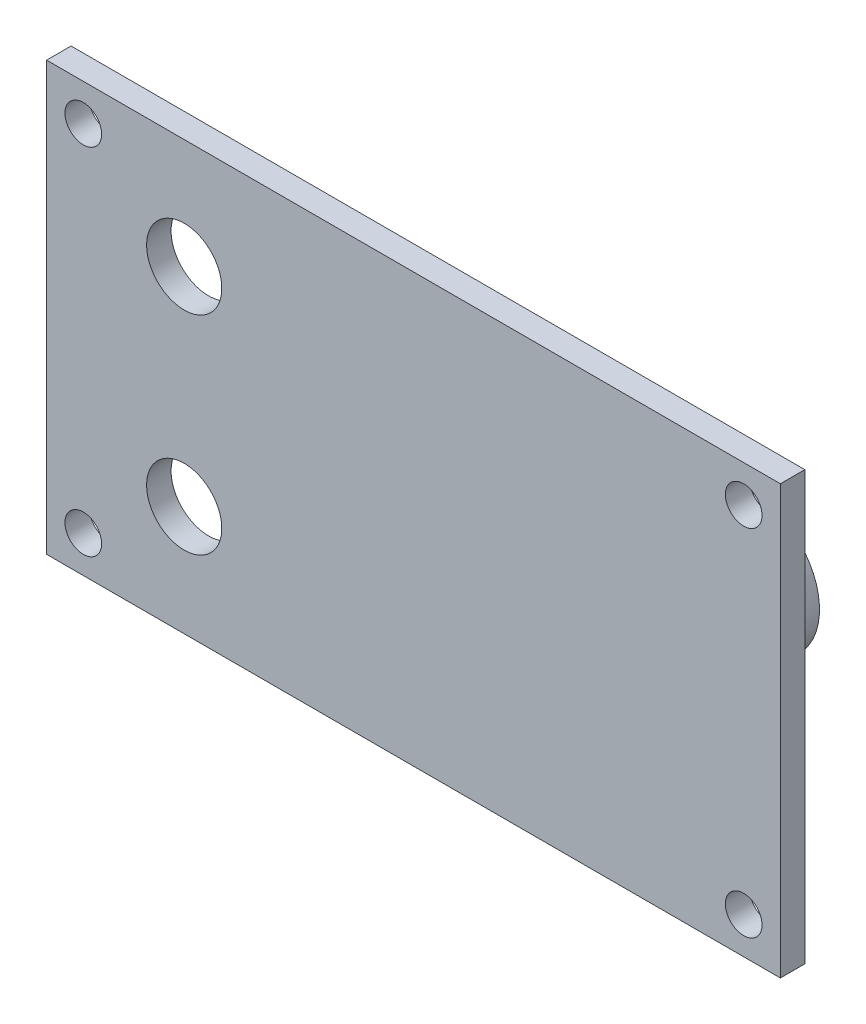
ISO-10303-21;
HEADER;
FILE_DESCRIPTION(('STEP AP214'),'2;1');
FILE_NAME('part.step','',(''),(''),'','','');
FILE_SCHEMA(('AUTOMOTIVE_DESIGN { 1 0 10303 214 1 1 1 1 }'));
ENDSEC;
DATA;
#1=APPLICATION_CONTEXT('core data for automotive mechanical design processes');
#2=APPLICATION_PROTOCOL_DEFINITION('international standard','automotive_design',2000,#1);
#3=PRODUCT_CONTEXT('',#1,'mechanical');
#4=PRODUCT('Part','Part','',(#3));
#5=PRODUCT_RELATED_PRODUCT_CATEGORY('part','',(#4));
#6=PRODUCT_DEFINITION_FORMATION('','',#4);
#7=PRODUCT_DEFINITION_CONTEXT('part definition',#1,'design');
#8=PRODUCT_DEFINITION('design','',#6,#7);
#9=PRODUCT_DEFINITION_SHAPE('','',#8);
#10=(LENGTH_UNIT() NAMED_UNIT(*) SI_UNIT(.MILLI.,.METRE.));
#11=(NAMED_UNIT(*) PLANE_ANGLE_UNIT() SI_UNIT($,.RADIAN.));
#12=(NAMED_UNIT(*) SI_UNIT($,.STERADIAN.) SOLID_ANGLE_UNIT());
#13=UNCERTAINTY_MEASURE_WITH_UNIT(LENGTH_MEASURE(1.E-05),#10,'distance_accuracy_value','');
#14=(GEOMETRIC_REPRESENTATION_CONTEXT(3) GLOBAL_UNCERTAINTY_ASSIGNED_CONTEXT((#13)) GLOBAL_UNIT_ASSIGNED_CONTEXT((#10,
#11,#12)) REPRESENTATION_CONTEXT('',''));
#15=CARTESIAN_POINT('',(0.,0.,0.));
#16=DIRECTION('',(0.,0.,1.));
#17=DIRECTION('',(1.,0.,0.));
#18=AXIS2_PLACEMENT_3D('',#15,#16,#17);
#19=CARTESIAN_POINT('',(0.,0.,2.));
#20=DIRECTION('',(0.,0.,-1.));
#21=DIRECTION('',(-1.,0.,0.));
#22=AXIS2_PLACEMENT_3D('',#19,#20,#21);
#23=PLANE('',#22);
#24=CARTESIAN_POINT('',(11.25,26.,2.));
#25=DIRECTION('',(0.,0.,-1.));
#26=DIRECTION('',(-1.,0.,0.));
#27=AXIS2_PLACEMENT_3D('',#24,#25,#26);
#28=CIRCLE('',#27,3.075);
#29=CARTESIAN_POINT('',(8.175,26.,2.));
#30=VERTEX_POINT('',#29);
#31=EDGE_CURVE('E554',#30,#30,#28,.T.);
#32=ORIENTED_EDGE('',*,*,#31,.T.);
#33=EDGE_LOOP('',(#32));
#34=FACE_BOUND('',#33,.T.);
#35=CARTESIAN_POINT('',(11.25,9.,2.));
#36=DIRECTION('',(0.,0.,-1.));
#37=DIRECTION('',(-1.,0.,0.));
#38=AXIS2_PLACEMENT_3D('',#35,#36,#37);
#39=CIRCLE('',#38,3.075);
#40=CARTESIAN_POINT('',(8.175,9.,2.));
#41=VERTEX_POINT('',#40);
#42=EDGE_CURVE('E569',#41,#41,#39,.T.);
#43=ORIENTED_EDGE('',*,*,#42,.T.);
#44=EDGE_LOOP('',(#43));
#45=FACE_BOUND('',#44,.T.);
#46=DIRECTION('',(0.,-1.,0.));
#47=VECTOR('',#46,1.);
#48=CARTESIAN_POINT('',(0.,0.,2.));
#49=LINE('',#48,#47);
#50=CARTESIAN_POINT('',(0.,35.,2.));
#51=VERTEX_POINT('',#50);
#52=CARTESIAN_POINT('',(0.,0.,2.));
#53=VERTEX_POINT('',#52);
#54=EDGE_CURVE('E111',#51,#53,#49,.T.);
#55=ORIENTED_EDGE('',*,*,#54,.T.);
#56=DIRECTION('',(1.,0.,0.));
#57=VECTOR('',#56,1.);
#58=CARTESIAN_POINT('',(0.,0.,2.));
#59=LINE('',#58,#57);
#60=CARTESIAN_POINT('',(60.,0.,2.));
#61=VERTEX_POINT('',#60);
#62=EDGE_CURVE('E100',#53,#61,#59,.T.);
#63=ORIENTED_EDGE('',*,*,#62,.T.);
#64=DIRECTION('',(0.,1.,0.));
#65=VECTOR('',#64,1.);
#66=CARTESIAN_POINT('',(60.,0.,2.));
#67=LINE('',#66,#65);
#68=CARTESIAN_POINT('',(60.,35.,2.));
#69=VERTEX_POINT('',#68);
#70=EDGE_CURVE('E110',#61,#69,#67,.T.);
#71=ORIENTED_EDGE('',*,*,#70,.T.);
#72=DIRECTION('',(-1.,0.,0.));
#73=VECTOR('',#72,1.);
#74=CARTESIAN_POINT('',(0.,35.,2.));
#75=LINE('',#74,#73);
#76=EDGE_CURVE('E116',#69,#51,#75,.T.);
#77=ORIENTED_EDGE('',*,*,#76,.T.);
#78=EDGE_LOOP('',(#55,#63,#71,#77));
#79=FACE_BOUND('',#78,.T.);
#80=CARTESIAN_POINT('',(57.,32.,2.));
#81=DIRECTION('',(0.,0.,1.));
#82=DIRECTION('',(1.,0.,0.));
#83=AXIS2_PLACEMENT_3D('',#80,#81,#82);
#84=CIRCLE('',#83,1.5);
#85=CARTESIAN_POINT('',(58.5,32.,2.));
#86=VERTEX_POINT('',#85);
#87=EDGE_CURVE('E517',#86,#86,#84,.T.);
#88=ORIENTED_EDGE('',*,*,#87,.F.);
#89=EDGE_LOOP('',(#88));
#90=FACE_BOUND('',#89,.T.);
#91=CARTESIAN_POINT('',(57.,3.,2.));
#92=DIRECTION('',(0.,0.,1.));
#93=DIRECTION('',(1.,0.,0.));
#94=AXIS2_PLACEMENT_3D('',#91,#92,#93);
#95=CIRCLE('',#94,1.5);
#96=CARTESIAN_POINT('',(58.5,3.,2.));
#97=VERTEX_POINT('',#96);
#98=EDGE_CURVE('E513',#97,#97,#95,.T.);
#99=ORIENTED_EDGE('',*,*,#98,.F.);
#100=EDGE_LOOP('',(#99));
#101=FACE_BOUND('',#100,.T.);
#102=CARTESIAN_POINT('',(3.,3.,2.));
#103=DIRECTION('',(0.,0.,1.));
#104=DIRECTION('',(1.,0.,0.));
#105=AXIS2_PLACEMENT_3D('',#102,#103,#104);
#106=CIRCLE('',#105,1.5);
#107=CARTESIAN_POINT('',(4.5,3.,2.));
#108=VERTEX_POINT('',#107);
#109=EDGE_CURVE('E509',#108,#108,#106,.T.);
#110=ORIENTED_EDGE('',*,*,#109,.F.);
#111=EDGE_LOOP('',(#110));
#112=FACE_BOUND('',#111,.T.);
#113=CARTESIAN_POINT('',(3.,32.,2.));
#114=DIRECTION('',(0.,0.,1.));
#115=DIRECTION('',(1.,0.,0.));
#116=AXIS2_PLACEMENT_3D('',#113,#114,#115);
#117=CIRCLE('',#116,1.5);
#118=CARTESIAN_POINT('',(4.5,32.,2.));
#119=VERTEX_POINT('',#118);
#120=EDGE_CURVE('E500',#119,#119,#117,.T.);
#121=ORIENTED_EDGE('',*,*,#120,.F.);
#122=EDGE_LOOP('',(#121));
#123=FACE_BOUND('',#122,.T.);
#124=ADVANCED_FACE('F39',(#34,#45,#79,#90,#101,#112,#123),#23,.F.);
#125=CARTESIAN_POINT('',(0.,0.,0.));
#126=DIRECTION('',(0.,0.,-1.));
#127=DIRECTION('',(-1.,0.,0.));
#128=AXIS2_PLACEMENT_3D('',#125,#126,#127);
#129=PLANE('',#128);
#130=CARTESIAN_POINT('',(36.25,15.5,0.));
#131=DIRECTION('',(0.,0.,-1.));
#132=DIRECTION('',(-1.,0.,0.));
#133=AXIS2_PLACEMENT_3D('',#130,#131,#132);
#134=CIRCLE('',#133,6.5);
#135=CARTESIAN_POINT('',(41.332414307152,19.5520445222697,0.));
#136=VERTEX_POINT('',#135);
#137=CARTESIAN_POINT('',(31.167585692848,19.5520445222697,0.));
#138=VERTEX_POINT('',#137);
#139=EDGE_CURVE('E61',#136,#138,#134,.F.);
#140=ORIENTED_EDGE('',*,*,#139,.T.);
#141=CARTESIAN_POINT('',(25.,17.5,0.));
#142=DIRECTION('',(0.,0.,-1.));
#143=DIRECTION('',(-1.,0.,0.));
#144=AXIS2_PLACEMENT_3D('',#141,#142,#143);
#145=CIRCLE('',#144,6.5);
#146=CARTESIAN_POINT('',(30.082414307152,13.4479554777303,0.));
#147=VERTEX_POINT('',#146);
#148=EDGE_CURVE('E138',#138,#147,#145,.F.);
#149=ORIENTED_EDGE('',*,*,#148,.T.);
#150=CARTESIAN_POINT('',(36.25,15.5,0.));
#151=DIRECTION('',(0.,0.,-1.));
#152=DIRECTION('',(-1.,0.,0.));
#153=AXIS2_PLACEMENT_3D('',#150,#151,#152);
#154=CIRCLE('',#153,6.5);
#155=CARTESIAN_POINT('',(42.417585692848,13.4479554777303,0.));
#156=VERTEX_POINT('',#155);
#157=EDGE_CURVE('E135',#147,#156,#154,.F.);
#158=ORIENTED_EDGE('',*,*,#157,.T.);
#159=CARTESIAN_POINT('',(47.5,17.5,0.));
#160=DIRECTION('',(0.,0.,-1.));
#161=DIRECTION('',(-1.,0.,0.));
#162=AXIS2_PLACEMENT_3D('',#159,#160,#161);
#163=CIRCLE('',#162,6.5);
#164=EDGE_CURVE('E128',#156,#136,#163,.F.);
#165=ORIENTED_EDGE('',*,*,#164,.T.);
#166=EDGE_LOOP('',(#140,#149,#158,#165));
#167=FACE_BOUND('',#166,.T.);
#168=CARTESIAN_POINT('',(11.25,26.,0.));
#169=DIRECTION('',(0.,0.,-1.));
#170=DIRECTION('',(-1.,0.,0.));
#171=AXIS2_PLACEMENT_3D('',#168,#169,#170);
#172=CIRCLE('',#171,3.075);
#173=CARTESIAN_POINT('',(8.175,26.,0.));
#174=VERTEX_POINT('',#173);
#175=EDGE_CURVE('E478',#174,#174,#172,.T.);
#176=ORIENTED_EDGE('',*,*,#175,.F.);
#177=EDGE_LOOP('',(#176));
#178=FACE_BOUND('',#177,.T.);
#179=CARTESIAN_POINT('',(11.25,9.,0.));
#180=DIRECTION('',(0.,0.,-1.));
#181=DIRECTION('',(-1.,0.,0.));
#182=AXIS2_PLACEMENT_3D('',#179,#180,#181);
#183=CIRCLE('',#182,3.075);
#184=CARTESIAN_POINT('',(8.175,9.,0.));
#185=VERTEX_POINT('',#184);
#186=EDGE_CURVE('E473',#185,#185,#183,.T.);
#187=ORIENTED_EDGE('',*,*,#186,.F.);
#188=EDGE_LOOP('',(#187));
#189=FACE_BOUND('',#188,.T.);
#190=CARTESIAN_POINT('',(3.,3.,0.));
#191=DIRECTION('',(0.,0.,1.));
#192=DIRECTION('',(1.,0.,0.));
#193=AXIS2_PLACEMENT_3D('',#190,#191,#192);
#194=CIRCLE('',#193,1.5);
#195=CARTESIAN_POINT('',(4.5,3.,0.));
#196=VERTEX_POINT('',#195);
#197=EDGE_CURVE('E485',#196,#196,#194,.T.);
#198=ORIENTED_EDGE('',*,*,#197,.T.);
#199=EDGE_LOOP('',(#198));
#200=FACE_BOUND('',#199,.T.);
#201=CARTESIAN_POINT('',(57.,32.,0.));
#202=DIRECTION('',(0.,0.,1.));
#203=DIRECTION('',(1.,0.,0.));
#204=AXIS2_PLACEMENT_3D('',#201,#202,#203);
#205=CIRCLE('',#204,1.5);
#206=CARTESIAN_POINT('',(58.5,32.,0.));
#207=VERTEX_POINT('',#206);
#208=EDGE_CURVE('E489',#207,#207,#205,.T.);
#209=ORIENTED_EDGE('',*,*,#208,.T.);
#210=EDGE_LOOP('',(#209));
#211=FACE_BOUND('',#210,.T.);
#212=DIRECTION('',(0.,-1.,0.));
#213=VECTOR('',#212,1.);
#214=CARTESIAN_POINT('',(0.,0.,0.));
#215=LINE('',#214,#213);
#216=CARTESIAN_POINT('',(0.,35.,0.));
#217=VERTEX_POINT('',#216);
#218=CARTESIAN_POINT('',(0.,0.,0.));
#219=VERTEX_POINT('',#218);
#220=EDGE_CURVE('E124',#217,#219,#215,.T.);
#221=ORIENTED_EDGE('',*,*,#220,.F.);
#222=DIRECTION('',(-1.,0.,0.));
#223=VECTOR('',#222,1.);
#224=CARTESIAN_POINT('',(0.,35.,0.));
#225=LINE('',#224,#223);
#226=CARTESIAN_POINT('',(60.,35.,0.));
#227=VERTEX_POINT('',#226);
#228=EDGE_CURVE('E120',#227,#217,#225,.T.);
#229=ORIENTED_EDGE('',*,*,#228,.F.);
#230=DIRECTION('',(0.,1.,0.));
#231=VECTOR('',#230,1.);
#232=CARTESIAN_POINT('',(60.,0.,0.));
#233=LINE('',#232,#231);
#234=CARTESIAN_POINT('',(60.,0.,0.));
#235=VERTEX_POINT('',#234);
#236=EDGE_CURVE('E527',#235,#227,#233,.T.);
#237=ORIENTED_EDGE('',*,*,#236,.F.);
#238=DIRECTION('',(1.,0.,0.));
#239=VECTOR('',#238,1.);
#240=CARTESIAN_POINT('',(0.,0.,0.));
#241=LINE('',#240,#239);
#242=EDGE_CURVE('E525',#219,#235,#241,.T.);
#243=ORIENTED_EDGE('',*,*,#242,.F.);
#244=EDGE_LOOP('',(#221,#229,#237,#243));
#245=FACE_BOUND('',#244,.T.);
#246=CARTESIAN_POINT('',(57.,3.,0.));
#247=DIRECTION('',(0.,0.,1.));
#248=DIRECTION('',(1.,0.,0.));
#249=AXIS2_PLACEMENT_3D('',#246,#247,#248);
#250=CIRCLE('',#249,1.5);
#251=CARTESIAN_POINT('',(58.5,3.,0.));
#252=VERTEX_POINT('',#251);
#253=EDGE_CURVE('E495',#252,#252,#250,.T.);
#254=ORIENTED_EDGE('',*,*,#253,.T.);
#255=EDGE_LOOP('',(#254));
#256=FACE_BOUND('',#255,.T.);
#257=CARTESIAN_POINT('',(3.,32.,0.));
#258=DIRECTION('',(0.,0.,1.));
#259=DIRECTION('',(1.,0.,0.));
#260=AXIS2_PLACEMENT_3D('',#257,#258,#259);
#261=CIRCLE('',#260,1.5);
#262=CARTESIAN_POINT('',(4.5,32.,0.));
#263=VERTEX_POINT('',#262);
#264=EDGE_CURVE('E498',#263,#263,#261,.T.);
#265=ORIENTED_EDGE('',*,*,#264,.T.);
#266=EDGE_LOOP('',(#265));
#267=FACE_BOUND('',#266,.T.);
#268=ADVANCED_FACE('F161',(#167,#178,#189,#200,#211,#245,#256,#267),#129,.T.);
#269=CARTESIAN_POINT('',(0.,0.,2.));
#270=DIRECTION('',(1.,0.,0.));
#271=DIRECTION('',(0.,0.,-1.));
#272=AXIS2_PLACEMENT_3D('',#269,#270,#271);
#273=PLANE('',#272);
#274=ORIENTED_EDGE('',*,*,#220,.T.);
#275=DIRECTION('',(0.,0.,-1.));
#276=VECTOR('',#275,1.);
#277=CARTESIAN_POINT('',(0.,0.,2.));
#278=LINE('',#277,#276);
#279=EDGE_CURVE('E104',#53,#219,#278,.T.);
#280=ORIENTED_EDGE('',*,*,#279,.F.);
#281=ORIENTED_EDGE('',*,*,#54,.F.);
#282=DIRECTION('',(0.,0.,-1.));
#283=VECTOR('',#282,1.);
#284=CARTESIAN_POINT('',(0.,35.,2.));
#285=LINE('',#284,#283);
#286=EDGE_CURVE('E523',#51,#217,#285,.T.);
#287=ORIENTED_EDGE('',*,*,#286,.T.);
#288=EDGE_LOOP('',(#274,#280,#281,#287));
#289=FACE_BOUND('',#288,.T.);
#290=ADVANCED_FACE('F122',(#289),#273,.F.);
#291=CARTESIAN_POINT('',(0.,0.,2.));
#292=DIRECTION('',(0.,1.,0.));
#293=DIRECTION('',(0.,0.,1.));
#294=AXIS2_PLACEMENT_3D('',#291,#292,#293);
#295=PLANE('',#294);
#296=ORIENTED_EDGE('',*,*,#242,.T.);
#297=DIRECTION('',(0.,0.,-1.));
#298=VECTOR('',#297,1.);
#299=CARTESIAN_POINT('',(60.,0.,2.));
#300=LINE('',#299,#298);
#301=EDGE_CURVE('E107',#61,#235,#300,.T.);
#302=ORIENTED_EDGE('',*,*,#301,.F.);
#303=ORIENTED_EDGE('',*,*,#62,.F.);
#304=ORIENTED_EDGE('',*,*,#279,.T.);
#305=EDGE_LOOP('',(#296,#302,#303,#304));
#306=FACE_BOUND('',#305,.T.);
#307=ADVANCED_FACE('F102',(#306),#295,.F.);
#308=CARTESIAN_POINT('',(60.,0.,2.));
#309=DIRECTION('',(-1.,0.,0.));
#310=DIRECTION('',(0.,0.,1.));
#311=AXIS2_PLACEMENT_3D('',#308,#309,#310);
#312=PLANE('',#311);
#313=ORIENTED_EDGE('',*,*,#236,.T.);
#314=DIRECTION('',(0.,0.,-1.));
#315=VECTOR('',#314,1.);
#316=CARTESIAN_POINT('',(60.,35.,2.));
#317=LINE('',#316,#315);
#318=EDGE_CURVE('E130',#69,#227,#317,.T.);
#319=ORIENTED_EDGE('',*,*,#318,.F.);
#320=ORIENTED_EDGE('',*,*,#70,.F.);
#321=ORIENTED_EDGE('',*,*,#301,.T.);
#322=EDGE_LOOP('',(#313,#319,#320,#321));
#323=FACE_BOUND('',#322,.T.);
#324=ADVANCED_FACE('F177',(#323),#312,.F.);
#325=CARTESIAN_POINT('',(0.,35.,2.));
#326=DIRECTION('',(0.,-1.,0.));
#327=DIRECTION('',(0.,0.,-1.));
#328=AXIS2_PLACEMENT_3D('',#325,#326,#327);
#329=PLANE('',#328);
#330=ORIENTED_EDGE('',*,*,#228,.T.);
#331=ORIENTED_EDGE('',*,*,#286,.F.);
#332=ORIENTED_EDGE('',*,*,#76,.F.);
#333=ORIENTED_EDGE('',*,*,#318,.T.);
#334=EDGE_LOOP('',(#330,#331,#332,#333));
#335=FACE_BOUND('',#334,.T.);
#336=ADVANCED_FACE('F174',(#335),#329,.F.);
#337=CARTESIAN_POINT('',(57.,32.,2.));
#338=DIRECTION('',(0.,0.,-1.));
#339=DIRECTION('',(-1.,0.,0.));
#340=AXIS2_PLACEMENT_3D('',#337,#338,#339);
#341=CYLINDRICAL_SURFACE('',#340,1.5);
#342=ORIENTED_EDGE('',*,*,#87,.T.);
#343=EDGE_LOOP('',(#342));
#344=FACE_BOUND('',#343,.T.);
#345=ORIENTED_EDGE('',*,*,#208,.F.);
#346=EDGE_LOOP('',(#345));
#347=FACE_BOUND('',#346,.T.);
#348=ADVANCED_FACE('F171',(#344,#347),#341,.F.);
#349=CARTESIAN_POINT('',(57.,3.,2.));
#350=DIRECTION('',(0.,0.,-1.));
#351=DIRECTION('',(-1.,0.,0.));
#352=AXIS2_PLACEMENT_3D('',#349,#350,#351);
#353=CYLINDRICAL_SURFACE('',#352,1.5);
#354=ORIENTED_EDGE('',*,*,#98,.T.);
#355=EDGE_LOOP('',(#354));
#356=FACE_BOUND('',#355,.T.);
#357=ORIENTED_EDGE('',*,*,#253,.F.);
#358=EDGE_LOOP('',(#357));
#359=FACE_BOUND('',#358,.T.);
#360=ADVANCED_FACE('F206',(#356,#359),#353,.F.);
#361=CARTESIAN_POINT('',(3.,3.,2.));
#362=DIRECTION('',(0.,0.,-1.));
#363=DIRECTION('',(-1.,0.,0.));
#364=AXIS2_PLACEMENT_3D('',#361,#362,#363);
#365=CYLINDRICAL_SURFACE('',#364,1.5);
#366=ORIENTED_EDGE('',*,*,#109,.T.);
#367=EDGE_LOOP('',(#366));
#368=FACE_BOUND('',#367,.T.);
#369=ORIENTED_EDGE('',*,*,#197,.F.);
#370=EDGE_LOOP('',(#369));
#371=FACE_BOUND('',#370,.T.);
#372=ADVANCED_FACE('F213',(#368,#371),#365,.F.);
#373=CARTESIAN_POINT('',(3.,32.,2.));
#374=DIRECTION('',(0.,0.,-1.));
#375=DIRECTION('',(-1.,0.,0.));
#376=AXIS2_PLACEMENT_3D('',#373,#374,#375);
#377=CYLINDRICAL_SURFACE('',#376,1.5);
#378=ORIENTED_EDGE('',*,*,#120,.T.);
#379=EDGE_LOOP('',(#378));
#380=FACE_BOUND('',#379,.T.);
#381=ORIENTED_EDGE('',*,*,#264,.F.);
#382=EDGE_LOOP('',(#381));
#383=FACE_BOUND('',#382,.T.);
#384=ADVANCED_FACE('F220',(#380,#383),#377,.F.);
#385=CARTESIAN_POINT('',(36.25,15.5,-8.2));
#386=DIRECTION('',(0.,0.,1.));
#387=DIRECTION('',(1.,0.,0.));
#388=AXIS2_PLACEMENT_3D('',#385,#386,#387);
#389=CYLINDRICAL_SURFACE('',#388,5.5);
#390=CARTESIAN_POINT('',(36.25,15.5,-1.));
#391=DIRECTION('',(0.,0.,-1.));
#392=DIRECTION('',(-1.,0.,0.));
#393=AXIS2_PLACEMENT_3D('',#390,#391,#392);
#394=CIRCLE('',#393,5.5);
#395=CARTESIAN_POINT('',(30.75,15.5,-1.));
#396=VERTEX_POINT('',#395);
#397=EDGE_CURVE('E53',#396,#396,#394,.T.);
#398=ORIENTED_EDGE('',*,*,#397,.T.);
#399=EDGE_LOOP('',(#398));
#400=FACE_BOUND('',#399,.T.);
#401=CARTESIAN_POINT('',(36.25,15.5,-8.2));
#402=DIRECTION('',(0.,0.,-1.));
#403=DIRECTION('',(-1.,0.,0.));
#404=AXIS2_PLACEMENT_3D('',#401,#402,#403);
#405=CIRCLE('',#404,5.5);
#406=CARTESIAN_POINT('',(30.75,15.5,-8.2));
#407=VERTEX_POINT('',#406);
#408=EDGE_CURVE('E501',#407,#407,#405,.T.);
#409=ORIENTED_EDGE('',*,*,#408,.F.);
#410=EDGE_LOOP('',(#409));
#411=FACE_BOUND('',#410,.T.);
#412=ADVANCED_FACE('F228',(#400,#411),#389,.T.);
#413=CARTESIAN_POINT('',(36.25,15.5,-8.2));
#414=DIRECTION('',(0.,0.,-1.));
#415=DIRECTION('',(-1.,0.,0.));
#416=AXIS2_PLACEMENT_3D('',#413,#414,#415);
#417=PLANE('',#416);
#418=CARTESIAN_POINT('',(36.25,15.5,-8.2));
#419=DIRECTION('',(0.,0.,-1.));
#420=DIRECTION('',(-1.,0.,0.));
#421=AXIS2_PLACEMENT_3D('',#418,#419,#420);
#422=CIRCLE('',#421,3.);
#423=CARTESIAN_POINT('',(33.25,15.5,-8.2));
#424=VERTEX_POINT('',#423);
#425=EDGE_CURVE('E560',#424,#424,#422,.T.);
#426=ORIENTED_EDGE('',*,*,#425,.F.);
#427=EDGE_LOOP('',(#426));
#428=FACE_BOUND('',#427,.T.);
#429=ORIENTED_EDGE('',*,*,#408,.T.);
#430=EDGE_LOOP('',(#429));
#431=FACE_BOUND('',#430,.T.);
#432=ADVANCED_FACE('F237',(#428,#431),#417,.T.);
#433=CARTESIAN_POINT('',(25.,17.5,-8.2));
#434=DIRECTION('',(0.,0.,1.));
#435=DIRECTION('',(1.,0.,0.));
#436=AXIS2_PLACEMENT_3D('',#433,#434,#435);
#437=CYLINDRICAL_SURFACE('',#436,5.5);
#438=CARTESIAN_POINT('',(25.,17.5,-1.));
#439=DIRECTION('',(0.,0.,-1.));
#440=DIRECTION('',(-1.,0.,0.));
#441=AXIS2_PLACEMENT_3D('',#438,#439,#440);
#442=CIRCLE('',#441,5.5);
#443=CARTESIAN_POINT('',(19.5,17.5,-1.));
#444=VERTEX_POINT('',#443);
#445=EDGE_CURVE('E125',#444,#444,#442,.T.);
#446=ORIENTED_EDGE('',*,*,#445,.T.);
#447=EDGE_LOOP('',(#446));
#448=FACE_BOUND('',#447,.T.);
#449=CARTESIAN_POINT('',(25.,17.5,-8.2));
#450=DIRECTION('',(0.,0.,-1.));
#451=DIRECTION('',(-1.,0.,0.));
#452=AXIS2_PLACEMENT_3D('',#449,#450,#451);
#453=CIRCLE('',#452,5.5);
#454=CARTESIAN_POINT('',(19.5,17.5,-8.2));
#455=VERTEX_POINT('',#454);
#456=EDGE_CURVE('E506',#455,#455,#453,.T.);
#457=ORIENTED_EDGE('',*,*,#456,.F.);
#458=EDGE_LOOP('',(#457));
#459=FACE_BOUND('',#458,.T.);
#460=ADVANCED_FACE('F245',(#448,#459),#437,.T.);
#461=CARTESIAN_POINT('',(25.,17.5,-8.2));
#462=DIRECTION('',(0.,0.,-1.));
#463=DIRECTION('',(-1.,0.,0.));
#464=AXIS2_PLACEMENT_3D('',#461,#462,#463);
#465=PLANE('',#464);
#466=CARTESIAN_POINT('',(25.,17.5,-8.2));
#467=DIRECTION('',(0.,0.,-1.));
#468=DIRECTION('',(-1.,0.,0.));
#469=AXIS2_PLACEMENT_3D('',#466,#467,#468);
#470=CIRCLE('',#469,3.);
#471=CARTESIAN_POINT('',(22.,17.5,-8.2));
#472=VERTEX_POINT('',#471);
#473=EDGE_CURVE('E553',#472,#472,#470,.T.);
#474=ORIENTED_EDGE('',*,*,#473,.F.);
#475=EDGE_LOOP('',(#474));
#476=FACE_BOUND('',#475,.T.);
#477=ORIENTED_EDGE('',*,*,#456,.T.);
#478=EDGE_LOOP('',(#477));
#479=FACE_BOUND('',#478,.T.);
#480=ADVANCED_FACE('F253',(#476,#479),#465,.T.);
#481=CARTESIAN_POINT('',(47.5,17.5,-8.2));
#482=DIRECTION('',(0.,0.,1.));
#483=DIRECTION('',(1.,0.,0.));
#484=AXIS2_PLACEMENT_3D('',#481,#482,#483);
#485=CYLINDRICAL_SURFACE('',#484,5.5);
#486=CARTESIAN_POINT('',(47.5,17.5,-1.));
#487=DIRECTION('',(0.,0.,-1.));
#488=DIRECTION('',(-1.,0.,0.));
#489=AXIS2_PLACEMENT_3D('',#486,#487,#488);
#490=CIRCLE('',#489,5.5);
#491=CARTESIAN_POINT('',(42.,17.5,-1.));
#492=VERTEX_POINT('',#491);
#493=EDGE_CURVE('E11',#492,#492,#490,.T.);
#494=ORIENTED_EDGE('',*,*,#493,.T.);
#495=EDGE_LOOP('',(#494));
#496=FACE_BOUND('',#495,.T.);
#497=CARTESIAN_POINT('',(47.5,17.5,-8.2));
#498=DIRECTION('',(0.,0.,-1.));
#499=DIRECTION('',(-1.,0.,0.));
#500=AXIS2_PLACEMENT_3D('',#497,#498,#499);
#501=CIRCLE('',#500,5.5);
#502=CARTESIAN_POINT('',(42.,17.5,-8.2));
#503=VERTEX_POINT('',#502);
#504=EDGE_CURVE('E546',#503,#503,#501,.T.);
#505=ORIENTED_EDGE('',*,*,#504,.F.);
#506=EDGE_LOOP('',(#505));
#507=FACE_BOUND('',#506,.T.);
#508=ADVANCED_FACE('F261',(#496,#507),#485,.T.);
#509=CARTESIAN_POINT('',(47.5,17.5,-8.2));
#510=DIRECTION('',(0.,0.,-1.));
#511=DIRECTION('',(-1.,0.,0.));
#512=AXIS2_PLACEMENT_3D('',#509,#510,#511);
#513=PLANE('',#512);
#514=CARTESIAN_POINT('',(47.5,17.5,-8.2));
#515=DIRECTION('',(0.,0.,-1.));
#516=DIRECTION('',(-1.,0.,0.));
#517=AXIS2_PLACEMENT_3D('',#514,#515,#516);
#518=CIRCLE('',#517,3.);
#519=CARTESIAN_POINT('',(44.5,17.5,-8.2));
#520=VERTEX_POINT('',#519);
#521=EDGE_CURVE('E563',#520,#520,#518,.T.);
#522=ORIENTED_EDGE('',*,*,#521,.F.);
#523=EDGE_LOOP('',(#522));
#524=FACE_BOUND('',#523,.T.);
#525=ORIENTED_EDGE('',*,*,#504,.T.);
#526=EDGE_LOOP('',(#525));
#527=FACE_BOUND('',#526,.T.);
#528=ADVANCED_FACE('F269',(#524,#527),#513,.T.);
#529=CARTESIAN_POINT('',(47.5,17.5,0.));
#530=DIRECTION('',(0.,0.,-1.));
#531=DIRECTION('',(-1.,0.,0.));
#532=AXIS2_PLACEMENT_3D('',#529,#530,#531);
#533=CYLINDRICAL_SURFACE('',#532,3.);
#534=CARTESIAN_POINT('',(47.5,17.5,0.));
#535=DIRECTION('',(0.,0.,-1.));
#536=DIRECTION('',(-1.,0.,0.));
#537=AXIS2_PLACEMENT_3D('',#534,#535,#536);
#538=CIRCLE('',#537,3.);
#539=CARTESIAN_POINT('',(44.5,17.5,0.));
#540=VERTEX_POINT('',#539);
#541=EDGE_CURVE('E549',#540,#540,#538,.T.);
#542=ORIENTED_EDGE('',*,*,#541,.F.);
#543=EDGE_LOOP('',(#542));
#544=FACE_BOUND('',#543,.T.);
#545=ORIENTED_EDGE('',*,*,#521,.T.);
#546=EDGE_LOOP('',(#545));
#547=FACE_BOUND('',#546,.T.);
#548=ADVANCED_FACE('F277',(#544,#547),#533,.F.);
#549=CARTESIAN_POINT('',(47.5,17.5,0.));
#550=DIRECTION('',(0.,0.,-1.));
#551=DIRECTION('',(-1.,0.,0.));
#552=AXIS2_PLACEMENT_3D('',#549,#550,#551);
#553=PLANE('',#552);
#554=ORIENTED_EDGE('',*,*,#541,.T.);
#555=EDGE_LOOP('',(#554));
#556=FACE_BOUND('',#555,.T.);
#557=ADVANCED_FACE('F285',(#556),#553,.T.);
#558=CARTESIAN_POINT('',(25.,17.5,0.));
#559=DIRECTION('',(0.,0.,-1.));
#560=DIRECTION('',(-1.,0.,0.));
#561=AXIS2_PLACEMENT_3D('',#558,#559,#560);
#562=CYLINDRICAL_SURFACE('',#561,3.);
#563=CARTESIAN_POINT('',(25.,17.5,0.));
#564=DIRECTION('',(0.,0.,-1.));
#565=DIRECTION('',(-1.,0.,0.));
#566=AXIS2_PLACEMENT_3D('',#563,#564,#565);
#567=CIRCLE('',#566,3.);
#568=CARTESIAN_POINT('',(22.,17.5,0.));
#569=VERTEX_POINT('',#568);
#570=EDGE_CURVE('E550',#569,#569,#567,.T.);
#571=ORIENTED_EDGE('',*,*,#570,.F.);
#572=EDGE_LOOP('',(#571));
#573=FACE_BOUND('',#572,.T.);
#574=ORIENTED_EDGE('',*,*,#473,.T.);
#575=EDGE_LOOP('',(#574));
#576=FACE_BOUND('',#575,.T.);
#577=ADVANCED_FACE('F293',(#573,#576),#562,.F.);
#578=CARTESIAN_POINT('',(25.,17.5,0.));
#579=DIRECTION('',(0.,0.,-1.));
#580=DIRECTION('',(-1.,0.,0.));
#581=AXIS2_PLACEMENT_3D('',#578,#579,#580);
#582=PLANE('',#581);
#583=ORIENTED_EDGE('',*,*,#570,.T.);
#584=EDGE_LOOP('',(#583));
#585=FACE_BOUND('',#584,.T.);
#586=ADVANCED_FACE('F301',(#585),#582,.T.);
#587=CARTESIAN_POINT('',(36.25,15.5,0.));
#588=DIRECTION('',(0.,0.,-1.));
#589=DIRECTION('',(-1.,0.,0.));
#590=AXIS2_PLACEMENT_3D('',#587,#588,#589);
#591=CYLINDRICAL_SURFACE('',#590,3.);
#592=CARTESIAN_POINT('',(36.25,15.5,0.));
#593=DIRECTION('',(0.,0.,-1.));
#594=DIRECTION('',(-1.,0.,0.));
#595=AXIS2_PLACEMENT_3D('',#592,#593,#594);
#596=CIRCLE('',#595,3.);
#597=CARTESIAN_POINT('',(33.25,15.5,0.));
#598=VERTEX_POINT('',#597);
#599=EDGE_CURVE('E557',#598,#598,#596,.T.);
#600=ORIENTED_EDGE('',*,*,#599,.F.);
#601=EDGE_LOOP('',(#600));
#602=FACE_BOUND('',#601,.T.);
#603=ORIENTED_EDGE('',*,*,#425,.T.);
#604=EDGE_LOOP('',(#603));
#605=FACE_BOUND('',#604,.T.);
#606=ADVANCED_FACE('F309',(#602,#605),#591,.F.);
#607=CARTESIAN_POINT('',(36.25,15.5,0.));
#608=DIRECTION('',(0.,0.,-1.));
#609=DIRECTION('',(-1.,0.,0.));
#610=AXIS2_PLACEMENT_3D('',#607,#608,#609);
#611=PLANE('',#610);
#612=ORIENTED_EDGE('',*,*,#599,.T.);
#613=EDGE_LOOP('',(#612));
#614=FACE_BOUND('',#613,.T.);
#615=ADVANCED_FACE('F317',(#614),#611,.T.);
#616=CARTESIAN_POINT('',(11.25,9.,8.2));
#617=DIRECTION('',(0.,0.,-1.));
#618=DIRECTION('',(-1.,0.,0.));
#619=AXIS2_PLACEMENT_3D('',#616,#617,#618);
#620=CYLINDRICAL_SURFACE('',#619,3.075);
#621=ORIENTED_EDGE('',*,*,#186,.T.);
#622=EDGE_LOOP('',(#621));
#623=FACE_BOUND('',#622,.T.);
#624=ORIENTED_EDGE('',*,*,#42,.F.);
#625=EDGE_LOOP('',(#624));
#626=FACE_BOUND('',#625,.T.);
#627=ADVANCED_FACE('F325',(#623,#626),#620,.F.);
#628=CARTESIAN_POINT('',(11.25,26.,8.2));
#629=DIRECTION('',(0.,0.,-1.));
#630=DIRECTION('',(-1.,0.,0.));
#631=AXIS2_PLACEMENT_3D('',#628,#629,#630);
#632=CYLINDRICAL_SURFACE('',#631,3.075);
#633=ORIENTED_EDGE('',*,*,#175,.T.);
#634=EDGE_LOOP('',(#633));
#635=FACE_BOUND('',#634,.T.);
#636=ORIENTED_EDGE('',*,*,#31,.F.);
#637=EDGE_LOOP('',(#636));
#638=FACE_BOUND('',#637,.T.);
#639=ADVANCED_FACE('F333',(#635,#638),#632,.F.);
#640=CARTESIAN_POINT('',(47.5,17.5,-1.));
#641=DIRECTION('',(0.,0.,-1.));
#642=DIRECTION('',(-1.,0.,0.));
#643=AXIS2_PLACEMENT_3D('',#640,#641,#642);
#644=TOROIDAL_SURFACE('',#643,6.5,1.);
#645=ORIENTED_EDGE('',*,*,#493,.F.);
#646=EDGE_LOOP('',(#645));
#647=FACE_BOUND('',#646,.T.);
#648=CARTESIAN_POINT('',(42.417585692848,13.4479554777303,0.));
#649=CARTESIAN_POINT('',(42.4171826851349,13.4502223961162,-1.27610643462313E-08));
#650=CARTESIAN_POINT('',(42.4167796762816,13.4524893209161,-1.82099008852764E-06));
#651=CARTESIAN_POINT('',(42.3870064564834,13.6199636822806,-0.00026744939947048));
#652=CARTESIAN_POINT('',(42.3576319946511,13.7851950300876,-0.0100220437288409));
#653=CARTESIAN_POINT('',(42.2991008141128,14.1144329206156,-0.0422224159030354));
#654=CARTESIAN_POINT('',(42.2699444154069,14.2784376633361,-0.0646841261080305));
#655=CARTESIAN_POINT('',(42.2117092666669,14.6060103749985,-0.117050174435888));
#656=CARTESIAN_POINT('',(42.182631483854,14.7695729033213,-0.146988128502463));
#657=CARTESIAN_POINT('',(42.12452659981,15.0964128760687,-0.208689097174232));
#658=CARTESIAN_POINT('',(42.0954995344966,15.2596901184568,-0.240453090120777));
#659=CARTESIAN_POINT('',(42.0368965951879,15.5893316520683,-0.299293928457694));
#660=CARTESIAN_POINT('',(42.0073184406856,15.7557087711434,-0.326305903983383));
#661=CARTESIAN_POINT('',(41.9627586780905,16.0063574357408,-0.35638353147975));
#662=CARTESIAN_POINT('',(41.9478903683399,16.0899916780883,-0.364665838967946));
#663=CARTESIAN_POINT('',(41.9180989876882,16.2575681942541,-0.376833745676967));
#664=CARTESIAN_POINT('',(41.9031759254335,16.3415104194368,-0.380720011456243));
#665=CARTESIAN_POINT('',(41.8733296406519,16.5093957713328,-0.383592392403713));
#666=CARTESIAN_POINT('',(41.8584064332751,16.5933388128274,-0.382583414689682));
#667=CARTESIAN_POINT('',(41.8285927911189,16.7610405499564,-0.375815961595403));
#668=CARTESIAN_POINT('',(41.813702360073,16.8447992245892,-0.37005697063165));
#669=CARTESIAN_POINT('',(41.769070572127,17.0958530317854,-0.346662729536272));
#670=CARTESIAN_POINT('',(41.7394317214154,17.2625715670384,-0.322908807353741));
#671=CARTESIAN_POINT('',(41.6942451635825,17.5167459548487,-0.280595918132511));
#672=CARTESIAN_POINT('',(41.6786046247851,17.6047239855837,-0.2648211200766));
#673=CARTESIAN_POINT('',(41.6473541464492,17.7805079262233,-0.232300199893949));
#674=CARTESIAN_POINT('',(41.6317442054595,17.8683138442903,-0.215554125042646));
#675=CARTESIAN_POINT('',(41.5849158506145,18.1317233402932,-0.165483319550592));
#676=CARTESIAN_POINT('',(41.5536910219657,18.3073630014429,-0.132317467529169));
#677=CARTESIAN_POINT('',(41.4911197274903,18.6593265328669,-0.0737142596515186));
#678=CARTESIAN_POINT('',(41.4597740585354,18.8356459207387,-0.0482505115200834));
#679=CARTESIAN_POINT('',(41.3968250986237,19.1897338202414,-0.0115477773008466));
#680=CARTESIAN_POINT('',(41.365222271996,19.3674997200216,-0.000287215476620496));
#681=CARTESIAN_POINT('',(41.3332203238918,19.5475106781089,-1.82249685188704E-06));
#682=CARTESIAN_POINT('',(41.3328173150437,19.5497776028793,-1.42884299458443E-08));
#683=CARTESIAN_POINT('',(41.332414307152,19.5520445222697,0.));
#684=B_SPLINE_CURVE_WITH_KNOTS('',3,(#648,#649,#650,#651,#652,#653,#654,#655,#656,#657,#658,
#659,#660,#661,#662,#663,#664,#665,#666,#667,#668,#669,#670,#671,#672,#673,#674,#675,#676,#677,
#678,#679,#680,#681,#682,#683),.UNSPECIFIED.,.F.,.F.,(4,2,2,2,2,2,2,2,2,2,2,2,2,2,2,2,2,4),(0.,
0.00690740763116257,0.510299849330131,1.01432485484147,1.52065828607944,2.02726557192583,
2.54032704080201,2.79627576778572,3.05218568083718,3.30783911625472,3.56352030486712,
4.07595709669108,4.34819104694251,4.62041175771761,5.16471565305131,5.70713272003755,
6.24872481735483,6.25563222498599),.UNSPECIFIED.);
#685=EDGE_CURVE('E44',#136,#156,#684,.F.);
#686=ORIENTED_EDGE('',*,*,#685,.F.);
#687=ORIENTED_EDGE('',*,*,#164,.F.);
#688=EDGE_LOOP('',(#686,#687));
#689=FACE_BOUND('',#688,.T.);
#690=ADVANCED_FACE('F41',(#647,#689),#644,.F.);
#691=CARTESIAN_POINT('',(36.25,15.5,-1.));
#692=DIRECTION('',(0.,0.,-1.));
#693=DIRECTION('',(-1.,0.,0.));
#694=AXIS2_PLACEMENT_3D('',#691,#692,#693);
#695=TOROIDAL_SURFACE('',#694,6.5,1.);
#696=ORIENTED_EDGE('',*,*,#397,.F.);
#697=EDGE_LOOP('',(#696));
#698=FACE_BOUND('',#697,.T.);
#699=CARTESIAN_POINT('',(30.082414307152,13.4479554777303,0.));
#700=CARTESIAN_POINT('',(30.0828173148651,13.4502223961162,-1.27610643087882E-08));
#701=CARTESIAN_POINT('',(30.0832203237184,13.4524893209161,-1.82099008849245E-06));
#702=CARTESIAN_POINT('',(30.1129935435165,13.6199636822806,-0.000267449399470602));
#703=CARTESIAN_POINT('',(30.1423680053489,13.7851950300877,-0.0100220437288406));
#704=CARTESIAN_POINT('',(30.2008991858872,14.1144329206156,-0.0422224159030346));
#705=CARTESIAN_POINT('',(30.2300555845931,14.2784376633361,-0.0646841261080296));
#706=CARTESIAN_POINT('',(30.2882907333331,14.6060103749985,-0.117050174435886));
#707=CARTESIAN_POINT('',(30.317368516146,14.7695729033213,-0.146988128502462));
#708=CARTESIAN_POINT('',(30.37547340019,15.0964128760687,-0.20868909717423));
#709=CARTESIAN_POINT('',(30.4045004655034,15.2596901184568,-0.240453090120775));
#710=CARTESIAN_POINT('',(30.4631034048121,15.5893316520683,-0.29929392845769));
#711=CARTESIAN_POINT('',(30.4926815593144,15.7557087711434,-0.326305903983378));
#712=CARTESIAN_POINT('',(30.5372413219095,16.0063574357408,-0.356383531479744));
#713=CARTESIAN_POINT('',(30.5521096316602,16.0899916780883,-0.364665838967941));
#714=CARTESIAN_POINT('',(30.5819010123118,16.2575681942541,-0.376833745676961));
#715=CARTESIAN_POINT('',(30.5968240745665,16.3415104194368,-0.380720011456235));
#716=CARTESIAN_POINT('',(30.6266703593481,16.5093957713328,-0.383592392403704));
#717=CARTESIAN_POINT('',(30.6415935667249,16.5933388128275,-0.382583414689672));
#718=CARTESIAN_POINT('',(30.6714072088811,16.7610405499564,-0.375815961595392));
#719=CARTESIAN_POINT('',(30.686297639927,16.8447992245893,-0.370056970631639));
#720=CARTESIAN_POINT('',(30.730929427873,17.0958530317854,-0.34666272953626));
#721=CARTESIAN_POINT('',(30.7605682785846,17.2625715670385,-0.322908807353728));
#722=CARTESIAN_POINT('',(30.8057548364175,17.5167459548487,-0.280595918132498));
#723=CARTESIAN_POINT('',(30.8213953752149,17.6047239855838,-0.264821120076587));
#724=CARTESIAN_POINT('',(30.8526458535508,17.7805079262233,-0.232300199893938));
#725=CARTESIAN_POINT('',(30.8682557945405,17.8683138442904,-0.215554125042636));
#726=CARTESIAN_POINT('',(30.9150841493855,18.1317233402932,-0.165483319550585));
#727=CARTESIAN_POINT('',(30.9463089780343,18.3073630014429,-0.132317467529163));
#728=CARTESIAN_POINT('',(31.0088802725097,18.6593265328669,-0.0737142596515145));
#729=CARTESIAN_POINT('',(31.0402259414647,18.8356459207387,-0.0482505115200802));
#730=CARTESIAN_POINT('',(31.1031749013762,19.1897338202414,-0.0115477773008468));
#731=CARTESIAN_POINT('',(31.1347777280038,19.3674997200216,-0.000287215476623373));
#732=CARTESIAN_POINT('',(31.1667796761082,19.5475106781089,-1.82249685188396E-06));
#733=CARTESIAN_POINT('',(31.1671826849563,19.5497776028793,-1.42884299056043E-08));
#734=CARTESIAN_POINT('',(31.167585692848,19.5520445222697,0.));
#735=B_SPLINE_CURVE_WITH_KNOTS('',3,(#699,#700,#701,#702,#703,#704,#705,#706,#707,#708,#709,
#710,#711,#712,#713,#714,#715,#716,#717,#718,#719,#720,#721,#722,#723,#724,#725,#726,#727,#728,
#729,#730,#731,#732,#733,#734),.UNSPECIFIED.,.F.,.F.,(4,2,2,2,2,2,2,2,2,2,2,2,2,2,2,2,2,4),(0.,
0.00690740763116197,0.510299849330132,1.01432485484147,1.52065828607944,2.02726557192583,
2.54032704080202,2.79627576778574,3.0521856808372,3.30783911625474,3.56352030486715,
4.07595709669111,4.34819104694254,4.62041175771763,5.16471565305131,5.70713272003753,
6.2487248173548,6.25563222498596),.UNSPECIFIED.);
#736=EDGE_CURVE('E67',#138,#147,#735,.F.);
#737=ORIENTED_EDGE('',*,*,#736,.F.);
#738=ORIENTED_EDGE('',*,*,#139,.F.);
#739=ORIENTED_EDGE('',*,*,#685,.T.);
#740=ORIENTED_EDGE('',*,*,#157,.F.);
#741=EDGE_LOOP('',(#737,#738,#739,#740));
#742=FACE_BOUND('',#741,.T.);
#743=ADVANCED_FACE('F149',(#698,#742),#695,.F.);
#744=CARTESIAN_POINT('',(25.,17.5,-1.));
#745=DIRECTION('',(0.,0.,-1.));
#746=DIRECTION('',(-1.,0.,0.));
#747=AXIS2_PLACEMENT_3D('',#744,#745,#746);
#748=TOROIDAL_SURFACE('',#747,6.5,1.);
#749=ORIENTED_EDGE('',*,*,#148,.F.);
#750=ORIENTED_EDGE('',*,*,#736,.T.);
#751=EDGE_LOOP('',(#749,#750));
#752=FACE_BOUND('',#751,.T.);
#753=ORIENTED_EDGE('',*,*,#445,.F.);
#754=EDGE_LOOP('',(#753));
#755=FACE_BOUND('',#754,.T.);
#756=ADVANCED_FACE('F153',(#752,#755),#748,.F.);
#757=CLOSED_SHELL('',(#124,#268,#290,#307,#324,#336,#348,#360,#372,#384,#412,#432,#460,#480,
#508,#528,#548,#557,#577,#586,#606,#615,#627,#639,#690,#743,#756));
#758=MANIFOLD_SOLID_BREP('B2',#757);
#759=ADVANCED_BREP_SHAPE_REPRESENTATION('',(#18,#758),#14);
#760=SHAPE_DEFINITION_REPRESENTATION(#9,#759);
ENDSEC;
END-ISO-10303-21;
